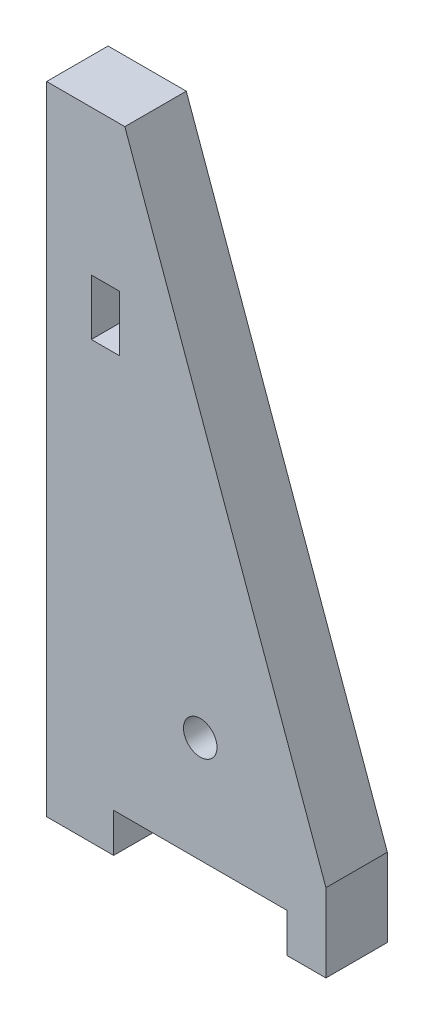
ISO-10303-21;
HEADER;
FILE_DESCRIPTION(('STEP AP214'),'2;1');
FILE_NAME('part.step','',(''),(''),'','','');
FILE_SCHEMA(('AUTOMOTIVE_DESIGN { 1 0 10303 214 1 1 1 1 }'));
ENDSEC;
DATA;
#1=APPLICATION_CONTEXT('core data for automotive mechanical design processes');
#2=APPLICATION_PROTOCOL_DEFINITION('international standard','automotive_design',2000,#1);
#3=PRODUCT_CONTEXT('',#1,'mechanical');
#4=PRODUCT('Part','Part','',(#3));
#5=PRODUCT_RELATED_PRODUCT_CATEGORY('part','',(#4));
#6=PRODUCT_DEFINITION_FORMATION('','',#4);
#7=PRODUCT_DEFINITION_CONTEXT('part definition',#1,'design');
#8=PRODUCT_DEFINITION('design','',#6,#7);
#9=PRODUCT_DEFINITION_SHAPE('','',#8);
#10=(LENGTH_UNIT() NAMED_UNIT(*) SI_UNIT(.MILLI.,.METRE.));
#11=(NAMED_UNIT(*) PLANE_ANGLE_UNIT() SI_UNIT($,.RADIAN.));
#12=(NAMED_UNIT(*) SI_UNIT($,.STERADIAN.) SOLID_ANGLE_UNIT());
#13=UNCERTAINTY_MEASURE_WITH_UNIT(LENGTH_MEASURE(1.E-05),#10,'distance_accuracy_value','');
#14=(GEOMETRIC_REPRESENTATION_CONTEXT(3) GLOBAL_UNCERTAINTY_ASSIGNED_CONTEXT((#13)) GLOBAL_UNIT_ASSIGNED_CONTEXT((#10,
#11,#12)) REPRESENTATION_CONTEXT('',''));
#15=CARTESIAN_POINT('',(0.,0.,0.));
#16=DIRECTION('',(0.,0.,1.));
#17=DIRECTION('',(1.,0.,0.));
#18=AXIS2_PLACEMENT_3D('',#15,#16,#17);
#19=CARTESIAN_POINT('',(0.,-50.,5.5));
#20=DIRECTION('',(0.,1.,0.));
#21=DIRECTION('',(0.,0.,1.));
#22=AXIS2_PLACEMENT_3D('',#19,#20,#21);
#23=PLANE('',#22);
#24=DIRECTION('',(1.,0.,0.));
#25=VECTOR('',#24,1.);
#26=CARTESIAN_POINT('',(0.,-50.,5.5));
#27=LINE('',#26,#25);
#28=CARTESIAN_POINT('',(21.5,-50.,5.5));
#29=VERTEX_POINT('',#28);
#30=CARTESIAN_POINT('',(25.,-50.,5.5));
#31=VERTEX_POINT('',#30);
#32=EDGE_CURVE('E215',#29,#31,#27,.T.);
#33=ORIENTED_EDGE('',*,*,#32,.F.);
#34=DIRECTION('',(0.,0.,1.));
#35=VECTOR('',#34,1.);
#36=CARTESIAN_POINT('',(21.5,-50.,0.));
#37=LINE('',#36,#35);
#38=CARTESIAN_POINT('',(21.5,-50.,0.));
#39=VERTEX_POINT('',#38);
#40=EDGE_CURVE('E187',#39,#29,#37,.T.);
#41=ORIENTED_EDGE('',*,*,#40,.F.);
#42=DIRECTION('',(1.,0.,0.));
#43=VECTOR('',#42,1.);
#44=CARTESIAN_POINT('',(0.,-50.,0.));
#45=LINE('',#44,#43);
#46=CARTESIAN_POINT('',(25.,-50.,0.));
#47=VERTEX_POINT('',#46);
#48=EDGE_CURVE('E224',#39,#47,#45,.T.);
#49=ORIENTED_EDGE('',*,*,#48,.T.);
#50=DIRECTION('',(0.,0.,-1.));
#51=VECTOR('',#50,1.);
#52=CARTESIAN_POINT('',(25.,-50.,5.5));
#53=LINE('',#52,#51);
#54=EDGE_CURVE('E231',#31,#47,#53,.T.);
#55=ORIENTED_EDGE('',*,*,#54,.F.);
#56=EDGE_LOOP('',(#33,#41,#49,#55));
#57=FACE_BOUND('',#56,.T.);
#58=ADVANCED_FACE('F40',(#57),#23,.F.);
#59=CARTESIAN_POINT('',(0.,0.,5.5));
#60=DIRECTION('',(1.,0.,0.));
#61=DIRECTION('',(0.,0.,-1.));
#62=AXIS2_PLACEMENT_3D('',#59,#60,#61);
#63=PLANE('',#62);
#64=DIRECTION('',(0.,0.,-1.));
#65=VECTOR('',#64,1.);
#66=CARTESIAN_POINT('',(0.,-50.,5.5));
#67=LINE('',#66,#65);
#68=CARTESIAN_POINT('',(0.,-50.,5.5));
#69=VERTEX_POINT('',#68);
#70=CARTESIAN_POINT('',(0.,-50.,0.));
#71=VERTEX_POINT('',#70);
#72=EDGE_CURVE('E234',#69,#71,#67,.T.);
#73=ORIENTED_EDGE('',*,*,#72,.F.);
#74=DIRECTION('',(0.,-1.,0.));
#75=VECTOR('',#74,1.);
#76=CARTESIAN_POINT('',(0.,0.,5.5));
#77=LINE('',#76,#75);
#78=CARTESIAN_POINT('',(0.,7.,5.5));
#79=VERTEX_POINT('',#78);
#80=EDGE_CURVE('E213',#79,#69,#77,.T.);
#81=ORIENTED_EDGE('',*,*,#80,.F.);
#82=DIRECTION('',(0.,0.,1.));
#83=VECTOR('',#82,1.);
#84=CARTESIAN_POINT('',(0.,7.,0.));
#85=LINE('',#84,#83);
#86=CARTESIAN_POINT('',(0.,7.,0.));
#87=VERTEX_POINT('',#86);
#88=EDGE_CURVE('E208',#87,#79,#85,.T.);
#89=ORIENTED_EDGE('',*,*,#88,.F.);
#90=DIRECTION('',(0.,-1.,0.));
#91=VECTOR('',#90,1.);
#92=CARTESIAN_POINT('',(0.,0.,0.));
#93=LINE('',#92,#91);
#94=EDGE_CURVE('E211',#87,#71,#93,.T.);
#95=ORIENTED_EDGE('',*,*,#94,.T.);
#96=EDGE_LOOP('',(#73,#81,#89,#95));
#97=FACE_BOUND('',#96,.T.);
#98=ADVANCED_FACE('F42',(#97),#63,.F.);
#99=CARTESIAN_POINT('',(6.,-50.,0.));
#100=VERTEX_POINT('',#99);
#101=EDGE_CURVE('E225',#71,#100,#45,.T.);
#102=ORIENTED_EDGE('',*,*,#101,.T.);
#103=DIRECTION('',(0.,0.,1.));
#104=VECTOR('',#103,1.);
#105=CARTESIAN_POINT('',(6.,-50.,0.));
#106=LINE('',#105,#104);
#107=CARTESIAN_POINT('',(6.,-50.,5.5));
#108=VERTEX_POINT('',#107);
#109=EDGE_CURVE('E190',#100,#108,#106,.T.);
#110=ORIENTED_EDGE('',*,*,#109,.T.);
#111=EDGE_CURVE('E217',#69,#108,#27,.T.);
#112=ORIENTED_EDGE('',*,*,#111,.F.);
#113=ORIENTED_EDGE('',*,*,#72,.T.);
#114=EDGE_LOOP('',(#102,#110,#112,#113));
#115=FACE_BOUND('',#114,.T.);
#116=ADVANCED_FACE('F261',(#115),#23,.F.);
#117=CARTESIAN_POINT('',(25.,-50.,5.5));
#118=DIRECTION('',(-1.,0.,0.));
#119=DIRECTION('',(0.,0.,1.));
#120=AXIS2_PLACEMENT_3D('',#117,#118,#119);
#121=PLANE('',#120);
#122=DIRECTION('',(0.,1.,0.));
#123=VECTOR('',#122,1.);
#124=CARTESIAN_POINT('',(25.,-50.,0.));
#125=LINE('',#124,#123);
#126=CARTESIAN_POINT('',(25.,-43.,0.));
#127=VERTEX_POINT('',#126);
#128=EDGE_CURVE('E216',#47,#127,#125,.T.);
#129=ORIENTED_EDGE('',*,*,#128,.T.);
#130=DIRECTION('',(0.,0.,-1.));
#131=VECTOR('',#130,1.);
#132=CARTESIAN_POINT('',(25.,-43.,5.5));
#133=LINE('',#132,#131);
#134=CARTESIAN_POINT('',(25.,-43.,5.5));
#135=VERTEX_POINT('',#134);
#136=EDGE_CURVE('E222',#135,#127,#133,.T.);
#137=ORIENTED_EDGE('',*,*,#136,.F.);
#138=DIRECTION('',(0.,1.,0.));
#139=VECTOR('',#138,1.);
#140=CARTESIAN_POINT('',(25.,-50.,5.5));
#141=LINE('',#140,#139);
#142=EDGE_CURVE('E220',#31,#135,#141,.T.);
#143=ORIENTED_EDGE('',*,*,#142,.F.);
#144=ORIENTED_EDGE('',*,*,#54,.T.);
#145=EDGE_LOOP('',(#129,#137,#143,#144));
#146=FACE_BOUND('',#145,.T.);
#147=ADVANCED_FACE('F269',(#146),#121,.F.);
#148=CARTESIAN_POINT('',(0.,0.,5.5));
#149=DIRECTION('',(0.,0.,1.));
#150=DIRECTION('',(1.,0.,0.));
#151=AXIS2_PLACEMENT_3D('',#148,#149,#150);
#152=PLANE('',#151);
#153=DIRECTION('',(0.,-1.,0.));
#154=VECTOR('',#153,1.);
#155=CARTESIAN_POINT('',(4.,-6.,5.5));
#156=LINE('',#155,#154);
#157=CARTESIAN_POINT('',(4.,-6.,5.5));
#158=VERTEX_POINT('',#157);
#159=CARTESIAN_POINT('',(4.,-11.,5.5));
#160=VERTEX_POINT('',#159);
#161=EDGE_CURVE('E55',#158,#160,#156,.T.);
#162=ORIENTED_EDGE('',*,*,#161,.F.);
#163=DIRECTION('',(-1.,0.,0.));
#164=VECTOR('',#163,1.);
#165=CARTESIAN_POINT('',(4.,-6.,5.5));
#166=LINE('',#165,#164);
#167=CARTESIAN_POINT('',(6.5,-6.,5.5));
#168=VERTEX_POINT('',#167);
#169=EDGE_CURVE('E154',#168,#158,#166,.T.);
#170=ORIENTED_EDGE('',*,*,#169,.F.);
#171=DIRECTION('',(0.,1.,0.));
#172=VECTOR('',#171,1.);
#173=CARTESIAN_POINT('',(6.5,-6.,5.5));
#174=LINE('',#173,#172);
#175=CARTESIAN_POINT('',(6.5,-11.,5.5));
#176=VERTEX_POINT('',#175);
#177=EDGE_CURVE('E138',#176,#168,#174,.T.);
#178=ORIENTED_EDGE('',*,*,#177,.F.);
#179=DIRECTION('',(1.,0.,0.));
#180=VECTOR('',#179,1.);
#181=CARTESIAN_POINT('',(4.,-11.,5.5));
#182=LINE('',#181,#180);
#183=EDGE_CURVE('E147',#160,#176,#182,.T.);
#184=ORIENTED_EDGE('',*,*,#183,.F.);
#185=EDGE_LOOP('',(#162,#170,#178,#184));
#186=FACE_BOUND('',#185,.T.);
#187=CARTESIAN_POINT('',(13.75,-37.,5.5));
#188=DIRECTION('',(0.,0.,1.));
#189=DIRECTION('',(1.,0.,0.));
#190=AXIS2_PLACEMENT_3D('',#187,#188,#189);
#191=CIRCLE('',#190,1.5);
#192=CARTESIAN_POINT('',(15.25,-37.,5.5));
#193=VERTEX_POINT('',#192);
#194=EDGE_CURVE('E161',#193,#193,#191,.T.);
#195=ORIENTED_EDGE('',*,*,#194,.F.);
#196=EDGE_LOOP('',(#195));
#197=FACE_BOUND('',#196,.T.);
#198=DIRECTION('',(0.,1.,0.));
#199=VECTOR('',#198,1.);
#200=CARTESIAN_POINT('',(21.5,-50.,5.5));
#201=LINE('',#200,#199);
#202=CARTESIAN_POINT('',(21.5,-46.5,5.5));
#203=VERTEX_POINT('',#202);
#204=EDGE_CURVE('E167',#29,#203,#201,.T.);
#205=ORIENTED_EDGE('',*,*,#204,.F.);
#206=ORIENTED_EDGE('',*,*,#32,.T.);
#207=ORIENTED_EDGE('',*,*,#142,.T.);
#208=DIRECTION('',(-0.338719468272742,0.940887411868727,0.));
#209=VECTOR('',#208,1.);
#210=CARTESIAN_POINT('',(7.,7.,5.5));
#211=LINE('',#210,#209);
#212=CARTESIAN_POINT('',(7.,7.,5.5));
#213=VERTEX_POINT('',#212);
#214=EDGE_CURVE('E189',#135,#213,#211,.T.);
#215=ORIENTED_EDGE('',*,*,#214,.T.);
#216=DIRECTION('',(-1.,0.,0.));
#217=VECTOR('',#216,1.);
#218=CARTESIAN_POINT('',(0.,7.,5.5));
#219=LINE('',#218,#217);
#220=EDGE_CURVE('E200',#213,#79,#219,.T.);
#221=ORIENTED_EDGE('',*,*,#220,.T.);
#222=ORIENTED_EDGE('',*,*,#80,.T.);
#223=ORIENTED_EDGE('',*,*,#111,.T.);
#224=DIRECTION('',(0.,-1.,0.));
#225=VECTOR('',#224,1.);
#226=CARTESIAN_POINT('',(6.,-50.,5.5));
#227=LINE('',#226,#225);
#228=CARTESIAN_POINT('',(6.,-46.5,5.5));
#229=VERTEX_POINT('',#228);
#230=EDGE_CURVE('E174',#229,#108,#227,.T.);
#231=ORIENTED_EDGE('',*,*,#230,.F.);
#232=DIRECTION('',(-1.,0.,0.));
#233=VECTOR('',#232,1.);
#234=CARTESIAN_POINT('',(21.5,-46.5,5.5));
#235=LINE('',#234,#233);
#236=EDGE_CURVE('E183',#203,#229,#235,.T.);
#237=ORIENTED_EDGE('',*,*,#236,.F.);
#238=EDGE_LOOP('',(#205,#206,#207,#215,#221,#222,#223,#231,#237));
#239=FACE_BOUND('',#238,.T.);
#240=ADVANCED_FACE('F151',(#186,#197,#239),#152,.T.);
#241=CARTESIAN_POINT('',(0.,0.,0.));
#242=DIRECTION('',(0.,0.,1.));
#243=DIRECTION('',(1.,0.,0.));
#244=AXIS2_PLACEMENT_3D('',#241,#242,#243);
#245=PLANE('',#244);
#246=DIRECTION('',(-1.,0.,0.));
#247=VECTOR('',#246,1.);
#248=CARTESIAN_POINT('',(0.,-6.,0.));
#249=LINE('',#248,#247);
#250=CARTESIAN_POINT('',(6.5,-6.,0.));
#251=VERTEX_POINT('',#250);
#252=CARTESIAN_POINT('',(4.,-6.,0.));
#253=VERTEX_POINT('',#252);
#254=EDGE_CURVE('E48',#251,#253,#249,.T.);
#255=ORIENTED_EDGE('',*,*,#254,.T.);
#256=DIRECTION('',(0.,-1.,0.));
#257=VECTOR('',#256,1.);
#258=CARTESIAN_POINT('',(4.,0.,0.));
#259=LINE('',#258,#257);
#260=CARTESIAN_POINT('',(4.,-11.,0.));
#261=VERTEX_POINT('',#260);
#262=EDGE_CURVE('E11',#253,#261,#259,.T.);
#263=ORIENTED_EDGE('',*,*,#262,.T.);
#264=DIRECTION('',(1.,0.,0.));
#265=VECTOR('',#264,1.);
#266=CARTESIAN_POINT('',(0.,-11.,0.));
#267=LINE('',#266,#265);
#268=CARTESIAN_POINT('',(6.5,-11.,0.));
#269=VERTEX_POINT('',#268);
#270=EDGE_CURVE('E237',#261,#269,#267,.T.);
#271=ORIENTED_EDGE('',*,*,#270,.T.);
#272=DIRECTION('',(0.,1.,0.));
#273=VECTOR('',#272,1.);
#274=CARTESIAN_POINT('',(6.5,0.,0.));
#275=LINE('',#274,#273);
#276=EDGE_CURVE('E141',#269,#251,#275,.T.);
#277=ORIENTED_EDGE('',*,*,#276,.T.);
#278=EDGE_LOOP('',(#255,#263,#271,#277));
#279=FACE_BOUND('',#278,.T.);
#280=CARTESIAN_POINT('',(13.75,-37.,0.));
#281=DIRECTION('',(0.,0.,1.));
#282=DIRECTION('',(1.,0.,0.));
#283=AXIS2_PLACEMENT_3D('',#280,#281,#282);
#284=CIRCLE('',#283,1.5);
#285=CARTESIAN_POINT('',(15.25,-37.,0.));
#286=VERTEX_POINT('',#285);
#287=EDGE_CURVE('E164',#286,#286,#284,.T.);
#288=ORIENTED_EDGE('',*,*,#287,.T.);
#289=EDGE_LOOP('',(#288));
#290=FACE_BOUND('',#289,.T.);
#291=ORIENTED_EDGE('',*,*,#48,.F.);
#292=DIRECTION('',(0.,1.,0.));
#293=VECTOR('',#292,1.);
#294=CARTESIAN_POINT('',(21.5,-50.,0.));
#295=LINE('',#294,#293);
#296=CARTESIAN_POINT('',(21.5,-46.5,0.));
#297=VERTEX_POINT('',#296);
#298=EDGE_CURVE('E170',#39,#297,#295,.T.);
#299=ORIENTED_EDGE('',*,*,#298,.T.);
#300=DIRECTION('',(-1.,0.,0.));
#301=VECTOR('',#300,1.);
#302=CARTESIAN_POINT('',(21.5,-46.5,0.));
#303=LINE('',#302,#301);
#304=CARTESIAN_POINT('',(6.,-46.5,0.));
#305=VERTEX_POINT('',#304);
#306=EDGE_CURVE('E173',#297,#305,#303,.T.);
#307=ORIENTED_EDGE('',*,*,#306,.T.);
#308=DIRECTION('',(0.,-1.,0.));
#309=VECTOR('',#308,1.);
#310=CARTESIAN_POINT('',(6.,-50.,0.));
#311=LINE('',#310,#309);
#312=EDGE_CURVE('E177',#305,#100,#311,.T.);
#313=ORIENTED_EDGE('',*,*,#312,.T.);
#314=ORIENTED_EDGE('',*,*,#101,.F.);
#315=ORIENTED_EDGE('',*,*,#94,.F.);
#316=DIRECTION('',(-1.,0.,0.));
#317=VECTOR('',#316,1.);
#318=CARTESIAN_POINT('',(0.,7.,0.));
#319=LINE('',#318,#317);
#320=CARTESIAN_POINT('',(7.,7.,0.));
#321=VERTEX_POINT('',#320);
#322=EDGE_CURVE('E199',#321,#87,#319,.T.);
#323=ORIENTED_EDGE('',*,*,#322,.F.);
#324=DIRECTION('',(-0.338719468272742,0.940887411868727,0.));
#325=VECTOR('',#324,1.);
#326=CARTESIAN_POINT('',(7.,7.,0.));
#327=LINE('',#326,#325);
#328=EDGE_CURVE('E196',#127,#321,#327,.T.);
#329=ORIENTED_EDGE('',*,*,#328,.F.);
#330=ORIENTED_EDGE('',*,*,#128,.F.);
#331=EDGE_LOOP('',(#291,#299,#307,#313,#314,#315,#323,#329,#330));
#332=FACE_BOUND('',#331,.T.);
#333=ADVANCED_FACE('F241',(#279,#290,#332),#245,.F.);
#334=CARTESIAN_POINT('',(7.,7.,0.));
#335=DIRECTION('',(0.940887411868727,0.338719468272742,0.));
#336=DIRECTION('',(-0.338719468272742,0.940887411868727,0.));
#337=AXIS2_PLACEMENT_3D('',#334,#335,#336);
#338=PLANE('',#337);
#339=ORIENTED_EDGE('',*,*,#214,.F.);
#340=ORIENTED_EDGE('',*,*,#136,.T.);
#341=ORIENTED_EDGE('',*,*,#328,.T.);
#342=DIRECTION('',(0.,0.,1.));
#343=VECTOR('',#342,1.);
#344=CARTESIAN_POINT('',(7.,7.,0.));
#345=LINE('',#344,#343);
#346=EDGE_CURVE('E203',#321,#213,#345,.T.);
#347=ORIENTED_EDGE('',*,*,#346,.T.);
#348=EDGE_LOOP('',(#339,#340,#341,#347));
#349=FACE_BOUND('',#348,.T.);
#350=ADVANCED_FACE('F298',(#349),#338,.T.);
#351=CARTESIAN_POINT('',(0.,7.,0.));
#352=DIRECTION('',(0.,1.,0.));
#353=DIRECTION('',(0.,0.,1.));
#354=AXIS2_PLACEMENT_3D('',#351,#352,#353);
#355=PLANE('',#354);
#356=ORIENTED_EDGE('',*,*,#220,.F.);
#357=ORIENTED_EDGE('',*,*,#346,.F.);
#358=ORIENTED_EDGE('',*,*,#322,.T.);
#359=ORIENTED_EDGE('',*,*,#88,.T.);
#360=EDGE_LOOP('',(#356,#357,#358,#359));
#361=FACE_BOUND('',#360,.T.);
#362=ADVANCED_FACE('F293',(#361),#355,.T.);
#363=CARTESIAN_POINT('',(21.5,-50.,0.));
#364=DIRECTION('',(1.,0.,0.));
#365=DIRECTION('',(0.,0.,-1.));
#366=AXIS2_PLACEMENT_3D('',#363,#364,#365);
#367=PLANE('',#366);
#368=ORIENTED_EDGE('',*,*,#204,.T.);
#369=DIRECTION('',(0.,0.,1.));
#370=VECTOR('',#369,1.);
#371=CARTESIAN_POINT('',(21.5,-46.5,0.));
#372=LINE('',#371,#370);
#373=EDGE_CURVE('E180',#297,#203,#372,.T.);
#374=ORIENTED_EDGE('',*,*,#373,.F.);
#375=ORIENTED_EDGE('',*,*,#298,.F.);
#376=ORIENTED_EDGE('',*,*,#40,.T.);
#377=EDGE_LOOP('',(#368,#374,#375,#376));
#378=FACE_BOUND('',#377,.T.);
#379=ADVANCED_FACE('F304',(#378),#367,.F.);
#380=CARTESIAN_POINT('',(6.,-50.,0.));
#381=DIRECTION('',(-1.,0.,0.));
#382=DIRECTION('',(0.,0.,1.));
#383=AXIS2_PLACEMENT_3D('',#380,#381,#382);
#384=PLANE('',#383);
#385=ORIENTED_EDGE('',*,*,#230,.T.);
#386=ORIENTED_EDGE('',*,*,#109,.F.);
#387=ORIENTED_EDGE('',*,*,#312,.F.);
#388=DIRECTION('',(0.,0.,1.));
#389=VECTOR('',#388,1.);
#390=CARTESIAN_POINT('',(6.,-46.5,0.));
#391=LINE('',#390,#389);
#392=EDGE_CURVE('E193',#305,#229,#391,.T.);
#393=ORIENTED_EDGE('',*,*,#392,.T.);
#394=EDGE_LOOP('',(#385,#386,#387,#393));
#395=FACE_BOUND('',#394,.T.);
#396=ADVANCED_FACE('F285',(#395),#384,.F.);
#397=CARTESIAN_POINT('',(21.5,-46.5,0.));
#398=DIRECTION('',(0.,1.,0.));
#399=DIRECTION('',(0.,0.,1.));
#400=AXIS2_PLACEMENT_3D('',#397,#398,#399);
#401=PLANE('',#400);
#402=ORIENTED_EDGE('',*,*,#236,.T.);
#403=ORIENTED_EDGE('',*,*,#392,.F.);
#404=ORIENTED_EDGE('',*,*,#306,.F.);
#405=ORIENTED_EDGE('',*,*,#373,.T.);
#406=EDGE_LOOP('',(#402,#403,#404,#405));
#407=FACE_BOUND('',#406,.T.);
#408=ADVANCED_FACE('F255',(#407),#401,.F.);
#409=CARTESIAN_POINT('',(13.75,-37.,0.));
#410=DIRECTION('',(0.,0.,1.));
#411=DIRECTION('',(1.,0.,0.));
#412=AXIS2_PLACEMENT_3D('',#409,#410,#411);
#413=CYLINDRICAL_SURFACE('',#412,1.5);
#414=ORIENTED_EDGE('',*,*,#287,.F.);
#415=EDGE_LOOP('',(#414));
#416=FACE_BOUND('',#415,.T.);
#417=ORIENTED_EDGE('',*,*,#194,.T.);
#418=EDGE_LOOP('',(#417));
#419=FACE_BOUND('',#418,.T.);
#420=ADVANCED_FACE('F248',(#416,#419),#413,.F.);
#421=CARTESIAN_POINT('',(4.,-6.,-4.5));
#422=DIRECTION('',(-1.,0.,0.));
#423=DIRECTION('',(0.,-1.,0.));
#424=AXIS2_PLACEMENT_3D('',#421,#422,#423);
#425=PLANE('',#424);
#426=DIRECTION('',(0.,0.,1.));
#427=VECTOR('',#426,1.);
#428=CARTESIAN_POINT('',(4.,-6.,-4.5));
#429=LINE('',#428,#427);
#430=EDGE_CURVE('E159',#253,#158,#429,.T.);
#431=ORIENTED_EDGE('',*,*,#430,.T.);
#432=ORIENTED_EDGE('',*,*,#161,.T.);
#433=DIRECTION('',(0.,0.,1.));
#434=VECTOR('',#433,1.);
#435=CARTESIAN_POINT('',(4.,-11.,-4.5));
#436=LINE('',#435,#434);
#437=EDGE_CURVE('E144',#261,#160,#436,.T.);
#438=ORIENTED_EDGE('',*,*,#437,.F.);
#439=ORIENTED_EDGE('',*,*,#262,.F.);
#440=EDGE_LOOP('',(#431,#432,#438,#439));
#441=FACE_BOUND('',#440,.T.);
#442=ADVANCED_FACE('F246',(#441),#425,.F.);
#443=CARTESIAN_POINT('',(4.,-6.,-4.5));
#444=DIRECTION('',(0.,1.,0.));
#445=DIRECTION('',(-1.,0.,0.));
#446=AXIS2_PLACEMENT_3D('',#443,#444,#445);
#447=PLANE('',#446);
#448=DIRECTION('',(0.,0.,1.));
#449=VECTOR('',#448,1.);
#450=CARTESIAN_POINT('',(6.5,-6.,-4.5));
#451=LINE('',#450,#449);
#452=EDGE_CURVE('E143',#251,#168,#451,.T.);
#453=ORIENTED_EDGE('',*,*,#452,.T.);
#454=ORIENTED_EDGE('',*,*,#169,.T.);
#455=ORIENTED_EDGE('',*,*,#430,.F.);
#456=ORIENTED_EDGE('',*,*,#254,.F.);
#457=EDGE_LOOP('',(#453,#454,#455,#456));
#458=FACE_BOUND('',#457,.T.);
#459=ADVANCED_FACE('F245',(#458),#447,.F.);
#460=CARTESIAN_POINT('',(6.5,-6.,-4.5));
#461=DIRECTION('',(1.,0.,0.));
#462=DIRECTION('',(0.,1.,0.));
#463=AXIS2_PLACEMENT_3D('',#460,#461,#462);
#464=PLANE('',#463);
#465=DIRECTION('',(0.,0.,1.));
#466=VECTOR('',#465,1.);
#467=CARTESIAN_POINT('',(6.5,-11.,-4.5));
#468=LINE('',#467,#466);
#469=EDGE_CURVE('E63',#269,#176,#468,.T.);
#470=ORIENTED_EDGE('',*,*,#469,.T.);
#471=ORIENTED_EDGE('',*,*,#177,.T.);
#472=ORIENTED_EDGE('',*,*,#452,.F.);
#473=ORIENTED_EDGE('',*,*,#276,.F.);
#474=EDGE_LOOP('',(#470,#471,#472,#473));
#475=FACE_BOUND('',#474,.T.);
#476=ADVANCED_FACE('F135',(#475),#464,.F.);
#477=CARTESIAN_POINT('',(4.,-11.,-4.5));
#478=DIRECTION('',(0.,-1.,0.));
#479=DIRECTION('',(0.,0.,-1.));
#480=AXIS2_PLACEMENT_3D('',#477,#478,#479);
#481=PLANE('',#480);
#482=ORIENTED_EDGE('',*,*,#437,.T.);
#483=ORIENTED_EDGE('',*,*,#183,.T.);
#484=ORIENTED_EDGE('',*,*,#469,.F.);
#485=ORIENTED_EDGE('',*,*,#270,.F.);
#486=EDGE_LOOP('',(#482,#483,#484,#485));
#487=FACE_BOUND('',#486,.T.);
#488=ADVANCED_FACE('F148',(#487),#481,.F.);
#489=CLOSED_SHELL('',(#58,#98,#116,#147,#240,#333,#350,#362,#379,#396,#408,#420,#442,#459,#476,#488));
#490=MANIFOLD_SOLID_BREP('B2',#489);
#491=ADVANCED_BREP_SHAPE_REPRESENTATION('',(#18,#490),#14);
#492=SHAPE_DEFINITION_REPRESENTATION(#9,#491);
ENDSEC;
END-ISO-10303-21;
